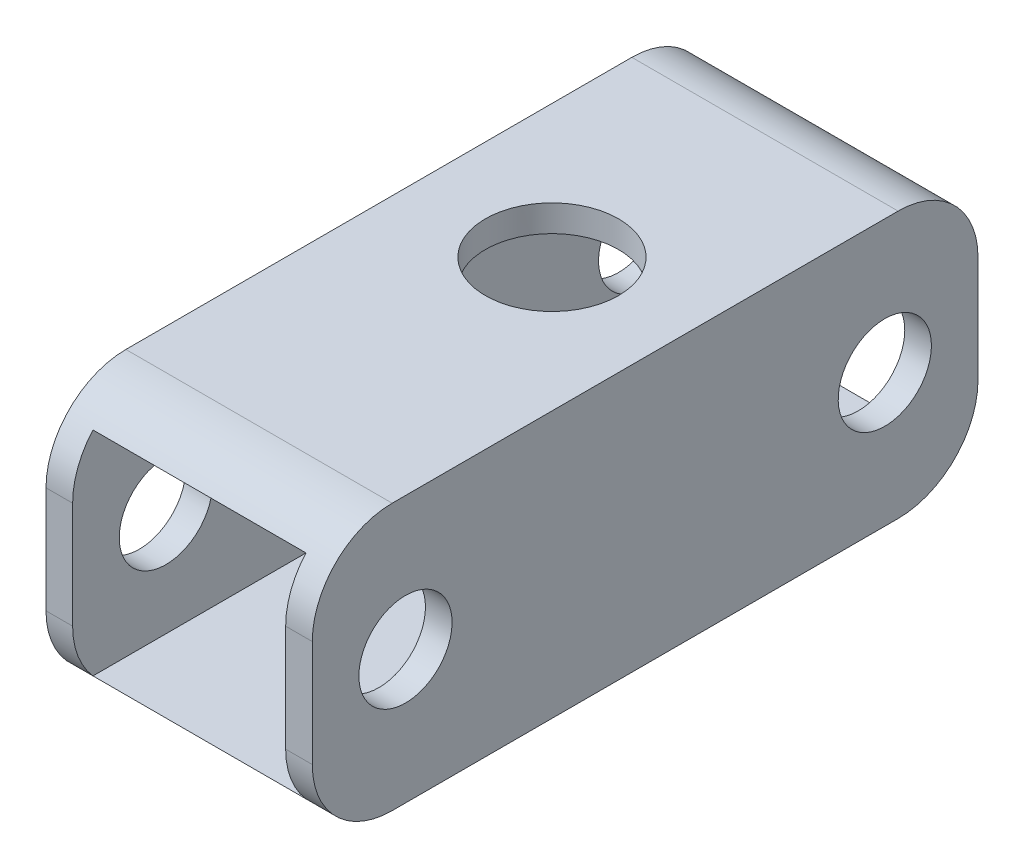
ISO-10303-21;
HEADER;
FILE_DESCRIPTION(('STEP AP214'),'2;1');
FILE_NAME('part.step','',(''),(''),'','','');
FILE_SCHEMA(('AUTOMOTIVE_DESIGN { 1 0 10303 214 1 1 1 1 }'));
ENDSEC;
DATA;
#1=APPLICATION_CONTEXT('core data for automotive mechanical design processes');
#2=APPLICATION_PROTOCOL_DEFINITION('international standard','automotive_design',2000,#1);
#3=PRODUCT_CONTEXT('',#1,'mechanical');
#4=PRODUCT('Part','Part','',(#3));
#5=PRODUCT_RELATED_PRODUCT_CATEGORY('part','',(#4));
#6=PRODUCT_DEFINITION_FORMATION('','',#4);
#7=PRODUCT_DEFINITION_CONTEXT('part definition',#1,'design');
#8=PRODUCT_DEFINITION('design','',#6,#7);
#9=PRODUCT_DEFINITION_SHAPE('','',#8);
#10=(LENGTH_UNIT() NAMED_UNIT(*) SI_UNIT(.MILLI.,.METRE.));
#11=(NAMED_UNIT(*) PLANE_ANGLE_UNIT() SI_UNIT($,.RADIAN.));
#12=(NAMED_UNIT(*) SI_UNIT($,.STERADIAN.) SOLID_ANGLE_UNIT());
#13=UNCERTAINTY_MEASURE_WITH_UNIT(LENGTH_MEASURE(1.E-05),#10,'distance_accuracy_value','');
#14=(GEOMETRIC_REPRESENTATION_CONTEXT(3) GLOBAL_UNCERTAINTY_ASSIGNED_CONTEXT((#13)) GLOBAL_UNIT_ASSIGNED_CONTEXT((#10,
#11,#12)) REPRESENTATION_CONTEXT('',''));
#15=CARTESIAN_POINT('',(0.,0.,0.));
#16=DIRECTION('',(0.,0.,1.));
#17=DIRECTION('',(1.,0.,0.));
#18=AXIS2_PLACEMENT_3D('',#15,#16,#17);
#19=CARTESIAN_POINT('',(-5.00000000000001,4.99999999999999,27.5));
#20=DIRECTION('',(0.,0.,1.));
#21=DIRECTION('',(1.,0.,0.));
#22=AXIS2_PLACEMENT_3D('',#19,#20,#21);
#23=PLANE('',#22);
#24=DIRECTION('',(0.,1.,0.));
#25=VECTOR('',#24,1.);
#26=CARTESIAN_POINT('',(4.99999999999999,-5.,27.5));
#27=LINE('',#26,#25);
#28=CARTESIAN_POINT('',(4.99999999999999,-2.,27.5));
#29=VERTEX_POINT('',#28);
#30=CARTESIAN_POINT('',(4.99999999999999,1.99999999999999,27.5));
#31=VERTEX_POINT('',#30);
#32=EDGE_CURVE('E157',#29,#31,#27,.T.);
#33=ORIENTED_EDGE('',*,*,#32,.T.);
#34=DIRECTION('',(-1.,0.,0.));
#35=VECTOR('',#34,1.);
#36=CARTESIAN_POINT('',(-5.00000000000001,1.99999999999999,27.5));
#37=LINE('',#36,#35);
#38=CARTESIAN_POINT('',(3.99999999999999,1.99999999999999,27.5));
#39=VERTEX_POINT('',#38);
#40=EDGE_CURVE('E12',#31,#39,#37,.T.);
#41=ORIENTED_EDGE('',*,*,#40,.T.);
#42=DIRECTION('',(0.,1.,0.));
#43=VECTOR('',#42,1.);
#44=CARTESIAN_POINT('',(3.99999999999999,-4.00000000000001,27.5));
#45=LINE('',#44,#43);
#46=CARTESIAN_POINT('',(3.99999999999999,-2.,27.5));
#47=VERTEX_POINT('',#46);
#48=EDGE_CURVE('E279',#47,#39,#45,.T.);
#49=ORIENTED_EDGE('',*,*,#48,.F.);
#50=DIRECTION('',(1.,0.,0.));
#51=VECTOR('',#50,1.);
#52=CARTESIAN_POINT('',(4.99999999999999,-2.,27.5));
#53=LINE('',#52,#51);
#54=EDGE_CURVE('E230',#47,#29,#53,.T.);
#55=ORIENTED_EDGE('',*,*,#54,.T.);
#56=EDGE_LOOP('',(#33,#41,#49,#55));
#57=FACE_BOUND('',#56,.T.);
#58=ADVANCED_FACE('F35',(#57),#23,.T.);
#59=CARTESIAN_POINT('',(-5.00000000000001,4.99999999999999,2.5));
#60=DIRECTION('',(0.,0.,1.));
#61=DIRECTION('',(1.,0.,0.));
#62=AXIS2_PLACEMENT_3D('',#59,#60,#61);
#63=PLANE('',#62);
#64=DIRECTION('',(0.,1.,0.));
#65=VECTOR('',#64,1.);
#66=CARTESIAN_POINT('',(4.99999999999999,-5.,2.5));
#67=LINE('',#66,#65);
#68=CARTESIAN_POINT('',(4.99999999999999,-2.,2.5));
#69=VERTEX_POINT('',#68);
#70=CARTESIAN_POINT('',(4.99999999999999,1.99999999999999,2.5));
#71=VERTEX_POINT('',#70);
#72=EDGE_CURVE('E246',#69,#71,#67,.T.);
#73=ORIENTED_EDGE('',*,*,#72,.F.);
#74=DIRECTION('',(1.,0.,0.));
#75=VECTOR('',#74,1.);
#76=CARTESIAN_POINT('',(-5.00000000000001,-2.,2.5));
#77=LINE('',#76,#75);
#78=CARTESIAN_POINT('',(3.99999999999999,-2.,2.5));
#79=VERTEX_POINT('',#78);
#80=EDGE_CURVE('E195',#69,#79,#77,.F.);
#81=ORIENTED_EDGE('',*,*,#80,.T.);
#82=DIRECTION('',(0.,1.,0.));
#83=VECTOR('',#82,1.);
#84=CARTESIAN_POINT('',(3.99999999999999,-4.00000000000001,2.5));
#85=LINE('',#84,#83);
#86=CARTESIAN_POINT('',(3.99999999999999,1.99999999999999,2.5));
#87=VERTEX_POINT('',#86);
#88=EDGE_CURVE('E181',#79,#87,#85,.T.);
#89=ORIENTED_EDGE('',*,*,#88,.T.);
#90=DIRECTION('',(-1.,0.,0.));
#91=VECTOR('',#90,1.);
#92=CARTESIAN_POINT('',(-5.00000000000001,1.99999999999999,2.5));
#93=LINE('',#92,#91);
#94=EDGE_CURVE('E189',#87,#71,#93,.F.);
#95=ORIENTED_EDGE('',*,*,#94,.T.);
#96=EDGE_LOOP('',(#73,#81,#89,#95));
#97=FACE_BOUND('',#96,.T.);
#98=ADVANCED_FACE('F326',(#97),#63,.F.);
#99=DIRECTION('',(0.,-1.,0.));
#100=VECTOR('',#99,1.);
#101=CARTESIAN_POINT('',(-4.00000000000001,-4.00000000000001,27.5));
#102=LINE('',#101,#100);
#103=CARTESIAN_POINT('',(-4.00000000000001,1.99999999999999,27.5));
#104=VERTEX_POINT('',#103);
#105=CARTESIAN_POINT('',(-4.00000000000001,-2.,27.5));
#106=VERTEX_POINT('',#105);
#107=EDGE_CURVE('E241',#104,#106,#102,.T.);
#108=ORIENTED_EDGE('',*,*,#107,.F.);
#109=DIRECTION('',(-1.,0.,0.));
#110=VECTOR('',#109,1.);
#111=CARTESIAN_POINT('',(-5.00000000000001,1.99999999999999,27.5));
#112=LINE('',#111,#110);
#113=CARTESIAN_POINT('',(-5.00000000000001,1.99999999999999,27.5));
#114=VERTEX_POINT('',#113);
#115=EDGE_CURVE('E43',#104,#114,#112,.T.);
#116=ORIENTED_EDGE('',*,*,#115,.T.);
#117=DIRECTION('',(0.,-1.,0.));
#118=VECTOR('',#117,1.);
#119=CARTESIAN_POINT('',(-5.00000000000001,-5.,27.5));
#120=LINE('',#119,#118);
#121=CARTESIAN_POINT('',(-5.00000000000001,-2.,27.5));
#122=VERTEX_POINT('',#121);
#123=EDGE_CURVE('E239',#114,#122,#120,.T.);
#124=ORIENTED_EDGE('',*,*,#123,.T.);
#125=DIRECTION('',(1.,0.,0.));
#126=VECTOR('',#125,1.);
#127=CARTESIAN_POINT('',(4.99999999999999,-2.,27.5));
#128=LINE('',#127,#126);
#129=EDGE_CURVE('E232',#122,#106,#128,.T.);
#130=ORIENTED_EDGE('',*,*,#129,.T.);
#131=EDGE_LOOP('',(#108,#116,#124,#130));
#132=FACE_BOUND('',#131,.T.);
#133=ADVANCED_FACE('F238',(#132),#23,.T.);
#134=DIRECTION('',(0.,-1.,0.));
#135=VECTOR('',#134,1.);
#136=CARTESIAN_POINT('',(-4.00000000000001,-4.00000000000001,2.5));
#137=LINE('',#136,#135);
#138=CARTESIAN_POINT('',(-4.00000000000001,1.99999999999999,2.5));
#139=VERTEX_POINT('',#138);
#140=CARTESIAN_POINT('',(-4.00000000000001,-2.,2.5));
#141=VERTEX_POINT('',#140);
#142=EDGE_CURVE('E287',#139,#141,#137,.T.);
#143=ORIENTED_EDGE('',*,*,#142,.T.);
#144=DIRECTION('',(1.,0.,0.));
#145=VECTOR('',#144,1.);
#146=CARTESIAN_POINT('',(-5.00000000000001,-2.,2.5));
#147=LINE('',#146,#145);
#148=CARTESIAN_POINT('',(-5.00000000000001,-2.,2.5));
#149=VERTEX_POINT('',#148);
#150=EDGE_CURVE('E193',#141,#149,#147,.F.);
#151=ORIENTED_EDGE('',*,*,#150,.T.);
#152=DIRECTION('',(0.,-1.,0.));
#153=VECTOR('',#152,1.);
#154=CARTESIAN_POINT('',(-5.00000000000001,-5.,2.5));
#155=LINE('',#154,#153);
#156=CARTESIAN_POINT('',(-5.00000000000001,1.99999999999999,2.5));
#157=VERTEX_POINT('',#156);
#158=EDGE_CURVE('E284',#157,#149,#155,.T.);
#159=ORIENTED_EDGE('',*,*,#158,.F.);
#160=DIRECTION('',(-1.,0.,0.));
#161=VECTOR('',#160,1.);
#162=CARTESIAN_POINT('',(-5.00000000000001,1.99999999999999,2.5));
#163=LINE('',#162,#161);
#164=EDGE_CURVE('E191',#157,#139,#163,.F.);
#165=ORIENTED_EDGE('',*,*,#164,.T.);
#166=EDGE_LOOP('',(#143,#151,#159,#165));
#167=FACE_BOUND('',#166,.T.);
#168=ADVANCED_FACE('F322',(#167),#63,.F.);
#169=CARTESIAN_POINT('',(-5.00000000000001,-5.,30.));
#170=DIRECTION('',(1.,0.,0.));
#171=DIRECTION('',(0.,0.,-1.));
#172=AXIS2_PLACEMENT_3D('',#169,#170,#171);
#173=PLANE('',#172);
#174=CARTESIAN_POINT('',(-5.00000000000001,0.,24.));
#175=DIRECTION('',(1.,0.,0.));
#176=DIRECTION('',(0.,0.,-1.));
#177=AXIS2_PLACEMENT_3D('',#174,#175,#176);
#178=CIRCLE('',#177,1.75);
#179=CARTESIAN_POINT('',(-5.00000000000001,0.,22.25));
#180=VERTEX_POINT('',#179);
#181=EDGE_CURVE('E485',#180,#180,#178,.T.);
#182=ORIENTED_EDGE('',*,*,#181,.T.);
#183=EDGE_LOOP('',(#182));
#184=FACE_BOUND('',#183,.T.);
#185=CARTESIAN_POINT('',(-5.00000000000001,0.,6.));
#186=DIRECTION('',(1.,0.,0.));
#187=DIRECTION('',(0.,0.,-1.));
#188=AXIS2_PLACEMENT_3D('',#185,#186,#187);
#189=CIRCLE('',#188,1.75);
#190=CARTESIAN_POINT('',(-5.00000000000001,0.,4.25));
#191=VERTEX_POINT('',#190);
#192=EDGE_CURVE('E289',#191,#191,#189,.T.);
#193=ORIENTED_EDGE('',*,*,#192,.T.);
#194=EDGE_LOOP('',(#193));
#195=FACE_BOUND('',#194,.T.);
#196=ORIENTED_EDGE('',*,*,#158,.T.);
#197=CARTESIAN_POINT('',(-5.00000000000001,-2.,5.5));
#198=DIRECTION('',(1.,0.,0.));
#199=DIRECTION('',(0.,0.,-1.));
#200=AXIS2_PLACEMENT_3D('',#197,#198,#199);
#201=CIRCLE('',#200,3.);
#202=CARTESIAN_POINT('',(-5.00000000000001,-5.,5.5));
#203=VERTEX_POINT('',#202);
#204=EDGE_CURVE('E220',#149,#203,#201,.F.);
#205=ORIENTED_EDGE('',*,*,#204,.T.);
#206=DIRECTION('',(0.,0.,-1.));
#207=VECTOR('',#206,1.);
#208=CARTESIAN_POINT('',(-5.00000000000001,-5.,30.));
#209=LINE('',#208,#207);
#210=CARTESIAN_POINT('',(-5.00000000000001,-5.,24.5));
#211=VERTEX_POINT('',#210);
#212=EDGE_CURVE('E171',#211,#203,#209,.T.);
#213=ORIENTED_EDGE('',*,*,#212,.F.);
#214=CARTESIAN_POINT('',(-5.00000000000001,-2.,24.5));
#215=DIRECTION('',(1.,0.,0.));
#216=DIRECTION('',(0.,0.,-1.));
#217=AXIS2_PLACEMENT_3D('',#214,#215,#216);
#218=CIRCLE('',#217,3.);
#219=EDGE_CURVE('E176',#211,#122,#218,.F.);
#220=ORIENTED_EDGE('',*,*,#219,.T.);
#221=ORIENTED_EDGE('',*,*,#123,.F.);
#222=CARTESIAN_POINT('',(-5.00000000000001,1.99999999999999,24.5));
#223=DIRECTION('',(1.,0.,0.));
#224=DIRECTION('',(0.,0.,-1.));
#225=AXIS2_PLACEMENT_3D('',#222,#223,#224);
#226=CIRCLE('',#225,3.);
#227=CARTESIAN_POINT('',(-5.00000000000001,4.99999999999999,24.5));
#228=VERTEX_POINT('',#227);
#229=EDGE_CURVE('E58',#114,#228,#226,.F.);
#230=ORIENTED_EDGE('',*,*,#229,.T.);
#231=DIRECTION('',(0.,0.,-1.));
#232=VECTOR('',#231,1.);
#233=CARTESIAN_POINT('',(-5.00000000000001,4.99999999999999,30.));
#234=LINE('',#233,#232);
#235=CARTESIAN_POINT('',(-5.00000000000001,4.99999999999999,5.5));
#236=VERTEX_POINT('',#235);
#237=EDGE_CURVE('E256',#228,#236,#234,.T.);
#238=ORIENTED_EDGE('',*,*,#237,.T.);
#239=CARTESIAN_POINT('',(-5.00000000000001,1.99999999999999,5.5));
#240=DIRECTION('',(1.,0.,0.));
#241=DIRECTION('',(0.,0.,-1.));
#242=AXIS2_PLACEMENT_3D('',#239,#240,#241);
#243=CIRCLE('',#242,3.);
#244=EDGE_CURVE('E50',#236,#157,#243,.F.);
#245=ORIENTED_EDGE('',*,*,#244,.T.);
#246=EDGE_LOOP('',(#196,#205,#213,#220,#221,#230,#238,#245));
#247=FACE_BOUND('',#246,.T.);
#248=ADVANCED_FACE('F245',(#184,#195,#247),#173,.F.);
#249=CARTESIAN_POINT('',(4.99999999999999,-5.,30.));
#250=DIRECTION('',(0.,1.,0.));
#251=DIRECTION('',(-1.,0.,0.));
#252=AXIS2_PLACEMENT_3D('',#249,#250,#251);
#253=PLANE('',#252);
#254=CARTESIAN_POINT('',(0.,-5.,13.5));
#255=DIRECTION('',(0.,-1.,0.));
#256=DIRECTION('',(1.,0.,0.));
#257=AXIS2_PLACEMENT_3D('',#254,#255,#256);
#258=CIRCLE('',#257,2.5);
#259=CARTESIAN_POINT('',(2.5,-5.,13.5));
#260=VERTEX_POINT('',#259);
#261=EDGE_CURVE('E276',#260,#260,#258,.T.);
#262=ORIENTED_EDGE('',*,*,#261,.F.);
#263=EDGE_LOOP('',(#262));
#264=FACE_BOUND('',#263,.T.);
#265=ORIENTED_EDGE('',*,*,#212,.T.);
#266=DIRECTION('',(1.,0.,0.));
#267=VECTOR('',#266,1.);
#268=CARTESIAN_POINT('',(4.99999999999999,-5.,5.5));
#269=LINE('',#268,#267);
#270=CARTESIAN_POINT('',(4.99999999999999,-5.,5.5));
#271=VERTEX_POINT('',#270);
#272=EDGE_CURVE('E162',#203,#271,#269,.T.);
#273=ORIENTED_EDGE('',*,*,#272,.T.);
#274=DIRECTION('',(0.,0.,-1.));
#275=VECTOR('',#274,1.);
#276=CARTESIAN_POINT('',(4.99999999999999,-5.,30.));
#277=LINE('',#276,#275);
#278=CARTESIAN_POINT('',(4.99999999999999,-5.,24.5));
#279=VERTEX_POINT('',#278);
#280=EDGE_CURVE('E155',#279,#271,#277,.T.);
#281=ORIENTED_EDGE('',*,*,#280,.F.);
#282=DIRECTION('',(1.,0.,0.));
#283=VECTOR('',#282,1.);
#284=CARTESIAN_POINT('',(-5.00000000000001,-5.,24.5));
#285=LINE('',#284,#283);
#286=EDGE_CURVE('E168',#279,#211,#285,.F.);
#287=ORIENTED_EDGE('',*,*,#286,.T.);
#288=EDGE_LOOP('',(#265,#273,#281,#287));
#289=FACE_BOUND('',#288,.T.);
#290=ADVANCED_FACE('F167',(#264,#289),#253,.F.);
#291=CARTESIAN_POINT('',(4.99999999999999,-5.,30.));
#292=DIRECTION('',(-1.,0.,0.));
#293=DIRECTION('',(0.,-1.,0.));
#294=AXIS2_PLACEMENT_3D('',#291,#292,#293);
#295=PLANE('',#294);
#296=CARTESIAN_POINT('',(4.99999999999999,0.,24.));
#297=DIRECTION('',(1.,0.,0.));
#298=DIRECTION('',(0.,1.,0.));
#299=AXIS2_PLACEMENT_3D('',#296,#297,#298);
#300=CIRCLE('',#299,1.75);
#301=CARTESIAN_POINT('',(4.99999999999999,1.75,24.));
#302=VERTEX_POINT('',#301);
#303=EDGE_CURVE('E272',#302,#302,#300,.T.);
#304=ORIENTED_EDGE('',*,*,#303,.F.);
#305=EDGE_LOOP('',(#304));
#306=FACE_BOUND('',#305,.T.);
#307=CARTESIAN_POINT('',(4.99999999999999,0.,6.));
#308=DIRECTION('',(1.,0.,0.));
#309=DIRECTION('',(0.,1.,0.));
#310=AXIS2_PLACEMENT_3D('',#307,#308,#309);
#311=CIRCLE('',#310,1.75);
#312=CARTESIAN_POINT('',(4.99999999999999,1.75,6.));
#313=VERTEX_POINT('',#312);
#314=EDGE_CURVE('E267',#313,#313,#311,.T.);
#315=ORIENTED_EDGE('',*,*,#314,.F.);
#316=EDGE_LOOP('',(#315));
#317=FACE_BOUND('',#316,.T.);
#318=ORIENTED_EDGE('',*,*,#280,.T.);
#319=CARTESIAN_POINT('',(4.99999999999999,-2.,5.5));
#320=DIRECTION('',(-1.,0.,0.));
#321=DIRECTION('',(0.,-1.,0.));
#322=AXIS2_PLACEMENT_3D('',#319,#320,#321);
#323=CIRCLE('',#322,3.);
#324=EDGE_CURVE('E187',#271,#69,#323,.F.);
#325=ORIENTED_EDGE('',*,*,#324,.T.);
#326=ORIENTED_EDGE('',*,*,#72,.T.);
#327=CARTESIAN_POINT('',(4.99999999999999,1.99999999999999,5.5));
#328=DIRECTION('',(-1.,0.,0.));
#329=DIRECTION('',(0.,-1.,0.));
#330=AXIS2_PLACEMENT_3D('',#327,#328,#329);
#331=CIRCLE('',#330,3.);
#332=CARTESIAN_POINT('',(4.99999999999998,4.99999999999999,5.5));
#333=VERTEX_POINT('',#332);
#334=EDGE_CURVE('E185',#71,#333,#331,.F.);
#335=ORIENTED_EDGE('',*,*,#334,.T.);
#336=DIRECTION('',(0.,0.,-1.));
#337=VECTOR('',#336,1.);
#338=CARTESIAN_POINT('',(4.99999999999998,4.99999999999999,30.));
#339=LINE('',#338,#337);
#340=CARTESIAN_POINT('',(4.99999999999998,4.99999999999999,24.5));
#341=VERTEX_POINT('',#340);
#342=EDGE_CURVE('E172',#341,#333,#339,.T.);
#343=ORIENTED_EDGE('',*,*,#342,.F.);
#344=CARTESIAN_POINT('',(4.99999999999999,1.99999999999999,24.5));
#345=DIRECTION('',(-1.,0.,0.));
#346=DIRECTION('',(0.,-1.,0.));
#347=AXIS2_PLACEMENT_3D('',#344,#345,#346);
#348=CIRCLE('',#347,3.);
#349=EDGE_CURVE('E161',#341,#31,#348,.F.);
#350=ORIENTED_EDGE('',*,*,#349,.T.);
#351=ORIENTED_EDGE('',*,*,#32,.F.);
#352=CARTESIAN_POINT('',(4.99999999999999,-2.,24.5));
#353=DIRECTION('',(-1.,0.,0.));
#354=DIRECTION('',(0.,-1.,0.));
#355=AXIS2_PLACEMENT_3D('',#352,#353,#354);
#356=CIRCLE('',#355,3.);
#357=EDGE_CURVE('E152',#29,#279,#356,.F.);
#358=ORIENTED_EDGE('',*,*,#357,.T.);
#359=EDGE_LOOP('',(#318,#325,#326,#335,#343,#350,#351,#358));
#360=FACE_BOUND('',#359,.T.);
#361=ADVANCED_FACE('F154',(#306,#317,#360),#295,.F.);
#362=CARTESIAN_POINT('',(4.99999999999998,4.99999999999999,30.));
#363=DIRECTION('',(0.,-1.,0.));
#364=DIRECTION('',(0.,0.,-1.));
#365=AXIS2_PLACEMENT_3D('',#362,#363,#364);
#366=PLANE('',#365);
#367=CARTESIAN_POINT('',(0.,4.99999999999999,13.5));
#368=DIRECTION('',(0.,-1.,0.));
#369=DIRECTION('',(0.,0.,-1.));
#370=AXIS2_PLACEMENT_3D('',#367,#368,#369);
#371=CIRCLE('',#370,2.5);
#372=CARTESIAN_POINT('',(0.,4.99999999999999,11.));
#373=VERTEX_POINT('',#372);
#374=EDGE_CURVE('E478',#373,#373,#371,.T.);
#375=ORIENTED_EDGE('',*,*,#374,.T.);
#376=EDGE_LOOP('',(#375));
#377=FACE_BOUND('',#376,.T.);
#378=ORIENTED_EDGE('',*,*,#342,.T.);
#379=DIRECTION('',(-1.,0.,0.));
#380=VECTOR('',#379,1.);
#381=CARTESIAN_POINT('',(4.99999999999998,4.99999999999999,5.5));
#382=LINE('',#381,#380);
#383=EDGE_CURVE('E224',#333,#236,#382,.T.);
#384=ORIENTED_EDGE('',*,*,#383,.T.);
#385=ORIENTED_EDGE('',*,*,#237,.F.);
#386=DIRECTION('',(-1.,0.,0.));
#387=VECTOR('',#386,1.);
#388=CARTESIAN_POINT('',(4.99999999999998,4.99999999999999,24.5));
#389=LINE('',#388,#387);
#390=EDGE_CURVE('E222',#228,#341,#389,.F.);
#391=ORIENTED_EDGE('',*,*,#390,.T.);
#392=EDGE_LOOP('',(#378,#384,#385,#391));
#393=FACE_BOUND('',#392,.T.);
#394=ADVANCED_FACE('F255',(#377,#393),#366,.F.);
#395=CARTESIAN_POINT('',(-4.00000000000001,-4.00000000000001,30.));
#396=DIRECTION('',(1.,0.,0.));
#397=DIRECTION('',(0.,0.,-1.));
#398=AXIS2_PLACEMENT_3D('',#395,#396,#397);
#399=PLANE('',#398);
#400=CARTESIAN_POINT('',(-4.00000000000001,0.,24.));
#401=DIRECTION('',(1.,0.,0.));
#402=DIRECTION('',(0.,0.,-1.));
#403=AXIS2_PLACEMENT_3D('',#400,#401,#402);
#404=CIRCLE('',#403,1.75);
#405=CARTESIAN_POINT('',(-4.00000000000001,0.,22.25));
#406=VERTEX_POINT('',#405);
#407=EDGE_CURVE('E271',#406,#406,#404,.T.);
#408=ORIENTED_EDGE('',*,*,#407,.F.);
#409=EDGE_LOOP('',(#408));
#410=FACE_BOUND('',#409,.T.);
#411=CARTESIAN_POINT('',(-4.00000000000001,0.,6.));
#412=DIRECTION('',(1.,0.,0.));
#413=DIRECTION('',(0.,0.,-1.));
#414=AXIS2_PLACEMENT_3D('',#411,#412,#413);
#415=CIRCLE('',#414,1.75);
#416=CARTESIAN_POINT('',(-4.00000000000001,0.,4.25));
#417=VERTEX_POINT('',#416);
#418=EDGE_CURVE('E266',#417,#417,#415,.T.);
#419=ORIENTED_EDGE('',*,*,#418,.F.);
#420=EDGE_LOOP('',(#419));
#421=FACE_BOUND('',#420,.T.);
#422=DIRECTION('',(0.,0.,-1.));
#423=VECTOR('',#422,1.);
#424=CARTESIAN_POINT('',(-4.00000000000001,-4.00000000000001,30.));
#425=LINE('',#424,#423);
#426=CARTESIAN_POINT('',(-4.00000000000001,-4.00000000000001,26.7360679774998));
#427=VERTEX_POINT('',#426);
#428=CARTESIAN_POINT('',(-4.00000000000001,-4.00000000000001,3.26393202250021));
#429=VERTEX_POINT('',#428);
#430=EDGE_CURVE('E286',#427,#429,#425,.T.);
#431=ORIENTED_EDGE('',*,*,#430,.T.);
#432=CARTESIAN_POINT('',(-4.00000000000001,-2.,5.5));
#433=DIRECTION('',(1.,0.,0.));
#434=DIRECTION('',(0.,0.,-1.));
#435=AXIS2_PLACEMENT_3D('',#432,#433,#434);
#436=CIRCLE('',#435,3.);
#437=EDGE_CURVE('E215',#429,#141,#436,.T.);
#438=ORIENTED_EDGE('',*,*,#437,.T.);
#439=ORIENTED_EDGE('',*,*,#142,.F.);
#440=CARTESIAN_POINT('',(-4.00000000000001,1.99999999999999,5.5));
#441=DIRECTION('',(1.,0.,0.));
#442=DIRECTION('',(0.,0.,-1.));
#443=AXIS2_PLACEMENT_3D('',#440,#441,#442);
#444=CIRCLE('',#443,3.);
#445=CARTESIAN_POINT('',(-4.00000000000001,4.,3.26393202250021));
#446=VERTEX_POINT('',#445);
#447=EDGE_CURVE('E213',#139,#446,#444,.T.);
#448=ORIENTED_EDGE('',*,*,#447,.T.);
#449=DIRECTION('',(0.,0.,-1.));
#450=VECTOR('',#449,1.);
#451=CARTESIAN_POINT('',(-4.00000000000001,4.,30.));
#452=LINE('',#451,#450);
#453=CARTESIAN_POINT('',(-4.00000000000001,4.,26.7360679774998));
#454=VERTEX_POINT('',#453);
#455=EDGE_CURVE('E282',#454,#446,#452,.T.);
#456=ORIENTED_EDGE('',*,*,#455,.F.);
#457=CARTESIAN_POINT('',(-4.00000000000001,1.99999999999999,24.5));
#458=DIRECTION('',(1.,0.,0.));
#459=DIRECTION('',(0.,0.,-1.));
#460=AXIS2_PLACEMENT_3D('',#457,#458,#459);
#461=CIRCLE('',#460,3.);
#462=EDGE_CURVE('E211',#454,#104,#461,.T.);
#463=ORIENTED_EDGE('',*,*,#462,.T.);
#464=ORIENTED_EDGE('',*,*,#107,.T.);
#465=CARTESIAN_POINT('',(-4.00000000000001,-2.,24.5));
#466=DIRECTION('',(1.,0.,0.));
#467=DIRECTION('',(0.,0.,-1.));
#468=AXIS2_PLACEMENT_3D('',#465,#466,#467);
#469=CIRCLE('',#468,3.);
#470=EDGE_CURVE('E209',#106,#427,#469,.T.);
#471=ORIENTED_EDGE('',*,*,#470,.T.);
#472=EDGE_LOOP('',(#431,#438,#439,#448,#456,#463,#464,#471));
#473=FACE_BOUND('',#472,.T.);
#474=ADVANCED_FACE('F313',(#410,#421,#473),#399,.T.);
#475=CARTESIAN_POINT('',(3.99999999999999,-4.00000000000001,30.));
#476=DIRECTION('',(0.,1.,0.));
#477=DIRECTION('',(0.,0.,1.));
#478=AXIS2_PLACEMENT_3D('',#475,#476,#477);
#479=PLANE('',#478);
#480=CARTESIAN_POINT('',(0.,-4.00000000000001,13.5));
#481=DIRECTION('',(0.,1.,0.));
#482=DIRECTION('',(0.,0.,1.));
#483=AXIS2_PLACEMENT_3D('',#480,#481,#482);
#484=CIRCLE('',#483,2.5);
#485=CARTESIAN_POINT('',(0.,-4.00000000000001,16.));
#486=VERTEX_POINT('',#485);
#487=EDGE_CURVE('E275',#486,#486,#484,.T.);
#488=ORIENTED_EDGE('',*,*,#487,.F.);
#489=EDGE_LOOP('',(#488));
#490=FACE_BOUND('',#489,.T.);
#491=DIRECTION('',(0.,0.,-1.));
#492=VECTOR('',#491,1.);
#493=CARTESIAN_POINT('',(3.99999999999999,-4.00000000000001,30.));
#494=LINE('',#493,#492);
#495=CARTESIAN_POINT('',(3.99999999999999,-4.00000000000001,26.7360679774998));
#496=VERTEX_POINT('',#495);
#497=CARTESIAN_POINT('',(3.99999999999999,-4.00000000000001,3.26393202250021));
#498=VERTEX_POINT('',#497);
#499=EDGE_CURVE('E307',#496,#498,#494,.T.);
#500=ORIENTED_EDGE('',*,*,#499,.T.);
#501=DIRECTION('',(1.,0.,0.));
#502=VECTOR('',#501,1.);
#503=CARTESIAN_POINT('',(3.99999999999999,-4.00000000000001,3.26393202250022));
#504=LINE('',#503,#502);
#505=EDGE_CURVE('E207',#498,#429,#504,.F.);
#506=ORIENTED_EDGE('',*,*,#505,.T.);
#507=ORIENTED_EDGE('',*,*,#430,.F.);
#508=DIRECTION('',(-1.,0.,0.));
#509=VECTOR('',#508,1.);
#510=CARTESIAN_POINT('',(-4.00000000000001,-4.00000000000001,26.7360679774998));
#511=LINE('',#510,#509);
#512=EDGE_CURVE('E205',#427,#496,#511,.F.);
#513=ORIENTED_EDGE('',*,*,#512,.T.);
#514=EDGE_LOOP('',(#500,#506,#507,#513));
#515=FACE_BOUND('',#514,.T.);
#516=ADVANCED_FACE('F344',(#490,#515),#479,.T.);
#517=CARTESIAN_POINT('',(3.99999999999999,-4.00000000000001,30.));
#518=DIRECTION('',(-1.,0.,0.));
#519=DIRECTION('',(0.,-1.,0.));
#520=AXIS2_PLACEMENT_3D('',#517,#518,#519);
#521=PLANE('',#520);
#522=CARTESIAN_POINT('',(3.99999999999999,0.,24.));
#523=DIRECTION('',(-1.,0.,0.));
#524=DIRECTION('',(0.,-1.,0.));
#525=AXIS2_PLACEMENT_3D('',#522,#523,#524);
#526=CIRCLE('',#525,1.75);
#527=CARTESIAN_POINT('',(3.99999999999999,-1.75,24.));
#528=VERTEX_POINT('',#527);
#529=EDGE_CURVE('E268',#528,#528,#526,.T.);
#530=ORIENTED_EDGE('',*,*,#529,.F.);
#531=EDGE_LOOP('',(#530));
#532=FACE_BOUND('',#531,.T.);
#533=CARTESIAN_POINT('',(3.99999999999999,0.,6.));
#534=DIRECTION('',(-1.,0.,0.));
#535=DIRECTION('',(0.,-1.,0.));
#536=AXIS2_PLACEMENT_3D('',#533,#534,#535);
#537=CIRCLE('',#536,1.75);
#538=CARTESIAN_POINT('',(3.99999999999999,-1.75,6.));
#539=VERTEX_POINT('',#538);
#540=EDGE_CURVE('E263',#539,#539,#537,.T.);
#541=ORIENTED_EDGE('',*,*,#540,.F.);
#542=EDGE_LOOP('',(#541));
#543=FACE_BOUND('',#542,.T.);
#544=ORIENTED_EDGE('',*,*,#88,.F.);
#545=CARTESIAN_POINT('',(3.99999999999999,-2.,5.5));
#546=DIRECTION('',(-1.,0.,0.));
#547=DIRECTION('',(0.,-1.,0.));
#548=AXIS2_PLACEMENT_3D('',#545,#546,#547);
#549=CIRCLE('',#548,3.);
#550=EDGE_CURVE('E203',#79,#498,#549,.T.);
#551=ORIENTED_EDGE('',*,*,#550,.T.);
#552=ORIENTED_EDGE('',*,*,#499,.F.);
#553=CARTESIAN_POINT('',(3.99999999999999,-2.,24.5));
#554=DIRECTION('',(-1.,0.,0.));
#555=DIRECTION('',(0.,-1.,0.));
#556=AXIS2_PLACEMENT_3D('',#553,#554,#555);
#557=CIRCLE('',#556,3.);
#558=EDGE_CURVE('E197',#496,#47,#557,.T.);
#559=ORIENTED_EDGE('',*,*,#558,.T.);
#560=ORIENTED_EDGE('',*,*,#48,.T.);
#561=CARTESIAN_POINT('',(3.99999999999999,1.99999999999999,24.5));
#562=DIRECTION('',(-1.,0.,0.));
#563=DIRECTION('',(0.,-1.,0.));
#564=AXIS2_PLACEMENT_3D('',#561,#562,#563);
#565=CIRCLE('',#564,3.);
#566=CARTESIAN_POINT('',(3.99999999999999,3.99999999999999,26.7360679774998));
#567=VERTEX_POINT('',#566);
#568=EDGE_CURVE('E199',#39,#567,#565,.T.);
#569=ORIENTED_EDGE('',*,*,#568,.T.);
#570=DIRECTION('',(0.,0.,-1.));
#571=VECTOR('',#570,1.);
#572=CARTESIAN_POINT('',(3.99999999999999,3.99999999999999,30.));
#573=LINE('',#572,#571);
#574=CARTESIAN_POINT('',(3.99999999999999,3.99999999999999,3.26393202250021));
#575=VERTEX_POINT('',#574);
#576=EDGE_CURVE('E304',#567,#575,#573,.T.);
#577=ORIENTED_EDGE('',*,*,#576,.T.);
#578=CARTESIAN_POINT('',(3.99999999999999,1.99999999999999,5.5));
#579=DIRECTION('',(-1.,0.,0.));
#580=DIRECTION('',(0.,-1.,0.));
#581=AXIS2_PLACEMENT_3D('',#578,#579,#580);
#582=CIRCLE('',#581,3.);
#583=EDGE_CURVE('E201',#575,#87,#582,.T.);
#584=ORIENTED_EDGE('',*,*,#583,.T.);
#585=EDGE_LOOP('',(#544,#551,#552,#559,#560,#569,#577,#584));
#586=FACE_BOUND('',#585,.T.);
#587=ADVANCED_FACE('F334',(#532,#543,#586),#521,.T.);
#588=CARTESIAN_POINT('',(3.99999999999999,3.99999999999999,30.));
#589=DIRECTION('',(0.,-1.,0.));
#590=DIRECTION('',(1.,0.,0.));
#591=AXIS2_PLACEMENT_3D('',#588,#589,#590);
#592=PLANE('',#591);
#593=CARTESIAN_POINT('',(0.,3.99999999999999,13.5));
#594=DIRECTION('',(0.,-1.,0.));
#595=DIRECTION('',(1.,0.,0.));
#596=AXIS2_PLACEMENT_3D('',#593,#594,#595);
#597=CIRCLE('',#596,2.5);
#598=CARTESIAN_POINT('',(2.5,3.99999999999999,13.5));
#599=VERTEX_POINT('',#598);
#600=EDGE_CURVE('E273',#599,#599,#597,.T.);
#601=ORIENTED_EDGE('',*,*,#600,.F.);
#602=EDGE_LOOP('',(#601));
#603=FACE_BOUND('',#602,.T.);
#604=ORIENTED_EDGE('',*,*,#455,.T.);
#605=DIRECTION('',(-1.,0.,0.));
#606=VECTOR('',#605,1.);
#607=CARTESIAN_POINT('',(-4.00000000000001,4.,3.26393202250021));
#608=LINE('',#607,#606);
#609=EDGE_CURVE('E228',#446,#575,#608,.F.);
#610=ORIENTED_EDGE('',*,*,#609,.T.);
#611=ORIENTED_EDGE('',*,*,#576,.F.);
#612=DIRECTION('',(1.,0.,0.));
#613=VECTOR('',#612,1.);
#614=CARTESIAN_POINT('',(3.99999999999999,3.99999999999999,26.7360679774998));
#615=LINE('',#614,#613);
#616=EDGE_CURVE('E226',#567,#454,#615,.F.);
#617=ORIENTED_EDGE('',*,*,#616,.T.);
#618=EDGE_LOOP('',(#604,#610,#611,#617));
#619=FACE_BOUND('',#618,.T.);
#620=ADVANCED_FACE('F338',(#603,#619),#592,.T.);
#621=CARTESIAN_POINT('',(-30.,0.,6.));
#622=DIRECTION('',(1.,0.,0.));
#623=DIRECTION('',(0.,1.,0.));
#624=AXIS2_PLACEMENT_3D('',#621,#622,#623);
#625=CYLINDRICAL_SURFACE('',#624,1.75);
#626=ORIENTED_EDGE('',*,*,#540,.T.);
#627=EDGE_LOOP('',(#626));
#628=FACE_BOUND('',#627,.T.);
#629=ORIENTED_EDGE('',*,*,#314,.T.);
#630=EDGE_LOOP('',(#629));
#631=FACE_BOUND('',#630,.T.);
#632=ADVANCED_FACE('F408',(#628,#631),#625,.F.);
#633=ORIENTED_EDGE('',*,*,#418,.T.);
#634=EDGE_LOOP('',(#633));
#635=FACE_BOUND('',#634,.T.);
#636=ORIENTED_EDGE('',*,*,#192,.F.);
#637=EDGE_LOOP('',(#636));
#638=FACE_BOUND('',#637,.T.);
#639=ADVANCED_FACE('F491',(#635,#638),#625,.F.);
#640=CARTESIAN_POINT('',(-30.,0.,24.));
#641=DIRECTION('',(1.,0.,0.));
#642=DIRECTION('',(0.,1.,0.));
#643=AXIS2_PLACEMENT_3D('',#640,#641,#642);
#644=CYLINDRICAL_SURFACE('',#643,1.75);
#645=ORIENTED_EDGE('',*,*,#529,.T.);
#646=EDGE_LOOP('',(#645));
#647=FACE_BOUND('',#646,.T.);
#648=ORIENTED_EDGE('',*,*,#303,.T.);
#649=EDGE_LOOP('',(#648));
#650=FACE_BOUND('',#649,.T.);
#651=ADVANCED_FACE('F497',(#647,#650),#644,.F.);
#652=ORIENTED_EDGE('',*,*,#407,.T.);
#653=EDGE_LOOP('',(#652));
#654=FACE_BOUND('',#653,.T.);
#655=ORIENTED_EDGE('',*,*,#181,.F.);
#656=EDGE_LOOP('',(#655));
#657=FACE_BOUND('',#656,.T.);
#658=ADVANCED_FACE('F502',(#654,#657),#644,.F.);
#659=CARTESIAN_POINT('',(0.,12.,13.5));
#660=DIRECTION('',(0.,-1.,0.));
#661=DIRECTION('',(1.,0.,0.));
#662=AXIS2_PLACEMENT_3D('',#659,#660,#661);
#663=CYLINDRICAL_SURFACE('',#662,2.5);
#664=ORIENTED_EDGE('',*,*,#600,.T.);
#665=EDGE_LOOP('',(#664));
#666=FACE_BOUND('',#665,.T.);
#667=ORIENTED_EDGE('',*,*,#374,.F.);
#668=EDGE_LOOP('',(#667));
#669=FACE_BOUND('',#668,.T.);
#670=ADVANCED_FACE('F504',(#666,#669),#663,.F.);
#671=ORIENTED_EDGE('',*,*,#487,.T.);
#672=EDGE_LOOP('',(#671));
#673=FACE_BOUND('',#672,.T.);
#674=ORIENTED_EDGE('',*,*,#261,.T.);
#675=EDGE_LOOP('',(#674));
#676=FACE_BOUND('',#675,.T.);
#677=ADVANCED_FACE('F376',(#673,#676),#663,.F.);
#678=CARTESIAN_POINT('',(4.99999999999999,-2.,5.5));
#679=DIRECTION('',(1.,0.,0.));
#680=DIRECTION('',(0.,1.,0.));
#681=AXIS2_PLACEMENT_3D('',#678,#679,#680);
#682=CYLINDRICAL_SURFACE('',#681,3.);
#683=ORIENTED_EDGE('',*,*,#550,.F.);
#684=ORIENTED_EDGE('',*,*,#80,.F.);
#685=ORIENTED_EDGE('',*,*,#324,.F.);
#686=ORIENTED_EDGE('',*,*,#272,.F.);
#687=ORIENTED_EDGE('',*,*,#204,.F.);
#688=ORIENTED_EDGE('',*,*,#150,.F.);
#689=ORIENTED_EDGE('',*,*,#437,.F.);
#690=ORIENTED_EDGE('',*,*,#505,.F.);
#691=EDGE_LOOP('',(#683,#684,#685,#686,#687,#688,#689,#690));
#692=FACE_BOUND('',#691,.T.);
#693=ADVANCED_FACE('F319',(#692),#682,.T.);
#694=CARTESIAN_POINT('',(4.99999999999998,1.99999999999999,5.5));
#695=DIRECTION('',(-1.,0.,0.));
#696=DIRECTION('',(0.,0.,1.));
#697=AXIS2_PLACEMENT_3D('',#694,#695,#696);
#698=CYLINDRICAL_SURFACE('',#697,3.);
#699=ORIENTED_EDGE('',*,*,#447,.F.);
#700=ORIENTED_EDGE('',*,*,#164,.F.);
#701=ORIENTED_EDGE('',*,*,#244,.F.);
#702=ORIENTED_EDGE('',*,*,#383,.F.);
#703=ORIENTED_EDGE('',*,*,#334,.F.);
#704=ORIENTED_EDGE('',*,*,#94,.F.);
#705=ORIENTED_EDGE('',*,*,#583,.F.);
#706=ORIENTED_EDGE('',*,*,#609,.F.);
#707=EDGE_LOOP('',(#699,#700,#701,#702,#703,#704,#705,#706));
#708=FACE_BOUND('',#707,.T.);
#709=ADVANCED_FACE('F331',(#708),#698,.T.);
#710=CARTESIAN_POINT('',(-5.00000000000001,1.99999999999999,24.5));
#711=DIRECTION('',(1.,0.,0.));
#712=DIRECTION('',(0.,0.,-1.));
#713=AXIS2_PLACEMENT_3D('',#710,#711,#712);
#714=CYLINDRICAL_SURFACE('',#713,3.);
#715=ORIENTED_EDGE('',*,*,#349,.F.);
#716=ORIENTED_EDGE('',*,*,#390,.F.);
#717=ORIENTED_EDGE('',*,*,#229,.F.);
#718=ORIENTED_EDGE('',*,*,#115,.F.);
#719=ORIENTED_EDGE('',*,*,#462,.F.);
#720=ORIENTED_EDGE('',*,*,#616,.F.);
#721=ORIENTED_EDGE('',*,*,#568,.F.);
#722=ORIENTED_EDGE('',*,*,#40,.F.);
#723=EDGE_LOOP('',(#715,#716,#717,#718,#719,#720,#721,#722));
#724=FACE_BOUND('',#723,.T.);
#725=ADVANCED_FACE('F250',(#724),#714,.T.);
#726=CARTESIAN_POINT('',(-5.00000000000001,-2.,24.5));
#727=DIRECTION('',(-1.,0.,0.));
#728=DIRECTION('',(0.,-1.,0.));
#729=AXIS2_PLACEMENT_3D('',#726,#727,#728);
#730=CYLINDRICAL_SURFACE('',#729,3.);
#731=ORIENTED_EDGE('',*,*,#219,.F.);
#732=ORIENTED_EDGE('',*,*,#286,.F.);
#733=ORIENTED_EDGE('',*,*,#357,.F.);
#734=ORIENTED_EDGE('',*,*,#54,.F.);
#735=ORIENTED_EDGE('',*,*,#558,.F.);
#736=ORIENTED_EDGE('',*,*,#512,.F.);
#737=ORIENTED_EDGE('',*,*,#470,.F.);
#738=ORIENTED_EDGE('',*,*,#129,.F.);
#739=EDGE_LOOP('',(#731,#732,#733,#734,#735,#736,#737,#738));
#740=FACE_BOUND('',#739,.T.);
#741=ADVANCED_FACE('F37',(#740),#730,.T.);
#742=CLOSED_SHELL('',(#58,#98,#133,#168,#248,#290,#361,#394,#474,#516,#587,#620,#632,#639,#651,
#658,#670,#677,#693,#709,#725,#741));
#743=MANIFOLD_SOLID_BREP('B2',#742);
#744=ADVANCED_BREP_SHAPE_REPRESENTATION('',(#18,#743),#14);
#745=SHAPE_DEFINITION_REPRESENTATION(#9,#744);
ENDSEC;
END-ISO-10303-21;
